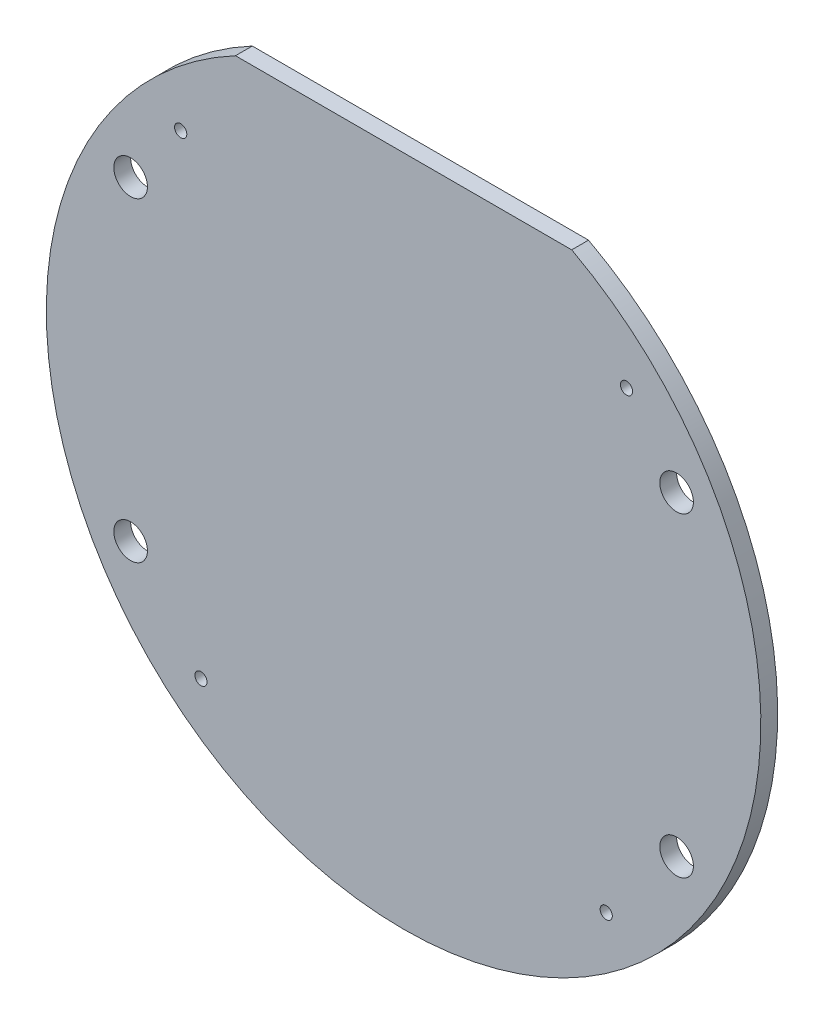
ISO-10303-21;
HEADER;
FILE_DESCRIPTION(('STEP AP214'),'2;1');
FILE_NAME('part.step','',(''),(''),'','','');
FILE_SCHEMA(('AUTOMOTIVE_DESIGN { 1 0 10303 214 1 1 1 1 }'));
ENDSEC;
DATA;
#1=APPLICATION_CONTEXT('core data for automotive mechanical design processes');
#2=APPLICATION_PROTOCOL_DEFINITION('international standard','automotive_design',2000,#1);
#3=PRODUCT_CONTEXT('',#1,'mechanical');
#4=PRODUCT('Part','Part','',(#3));
#5=PRODUCT_RELATED_PRODUCT_CATEGORY('part','',(#4));
#6=PRODUCT_DEFINITION_FORMATION('','',#4);
#7=PRODUCT_DEFINITION_CONTEXT('part definition',#1,'design');
#8=PRODUCT_DEFINITION('design','',#6,#7);
#9=PRODUCT_DEFINITION_SHAPE('','',#8);
#10=(LENGTH_UNIT() NAMED_UNIT(*) SI_UNIT(.MILLI.,.METRE.));
#11=(NAMED_UNIT(*) PLANE_ANGLE_UNIT() SI_UNIT($,.RADIAN.));
#12=(NAMED_UNIT(*) SI_UNIT($,.STERADIAN.) SOLID_ANGLE_UNIT());
#13=UNCERTAINTY_MEASURE_WITH_UNIT(LENGTH_MEASURE(1.E-05),#10,'distance_accuracy_value','');
#14=(GEOMETRIC_REPRESENTATION_CONTEXT(3) GLOBAL_UNCERTAINTY_ASSIGNED_CONTEXT((#13)) GLOBAL_UNIT_ASSIGNED_CONTEXT((#10,
#11,#12)) REPRESENTATION_CONTEXT('',''));
#15=CARTESIAN_POINT('',(0.,0.,0.));
#16=DIRECTION('',(0.,0.,1.));
#17=DIRECTION('',(1.,0.,0.));
#18=AXIS2_PLACEMENT_3D('',#15,#16,#17);
#19=CARTESIAN_POINT('',(0.,0.,4.));
#20=DIRECTION('',(0.,0.,-1.));
#21=DIRECTION('',(-1.,0.,0.));
#22=AXIS2_PLACEMENT_3D('',#19,#20,#21);
#23=CYLINDRICAL_SURFACE('',#22,85.);
#24=CARTESIAN_POINT('',(0.,0.,0.));
#25=DIRECTION('',(0.,0.,1.));
#26=DIRECTION('',(1.,0.,0.));
#27=AXIS2_PLACEMENT_3D('',#24,#25,#26);
#28=CIRCLE('',#27,85.);
#29=CARTESIAN_POINT('',(-40.,75.,0.));
#30=VERTEX_POINT('',#29);
#31=CARTESIAN_POINT('',(40.,75.,0.));
#32=VERTEX_POINT('',#31);
#33=EDGE_CURVE('E74',#30,#32,#28,.T.);
#34=ORIENTED_EDGE('',*,*,#33,.T.);
#35=DIRECTION('',(0.,0.,-1.));
#36=VECTOR('',#35,1.);
#37=CARTESIAN_POINT('',(40.,75.,4.));
#38=LINE('',#37,#36);
#39=CARTESIAN_POINT('',(40.,75.,4.));
#40=VERTEX_POINT('',#39);
#41=EDGE_CURVE('E11',#40,#32,#38,.T.);
#42=ORIENTED_EDGE('',*,*,#41,.F.);
#43=CARTESIAN_POINT('',(0.,0.,4.));
#44=DIRECTION('',(0.,0.,1.));
#45=DIRECTION('',(1.,0.,0.));
#46=AXIS2_PLACEMENT_3D('',#43,#44,#45);
#47=CIRCLE('',#46,85.);
#48=CARTESIAN_POINT('',(-40.,75.,4.));
#49=VERTEX_POINT('',#48);
#50=EDGE_CURVE('E73',#49,#40,#47,.T.);
#51=ORIENTED_EDGE('',*,*,#50,.F.);
#52=DIRECTION('',(0.,0.,-1.));
#53=VECTOR('',#52,1.);
#54=CARTESIAN_POINT('',(-40.,75.,4.));
#55=LINE('',#54,#53);
#56=EDGE_CURVE('E49',#49,#30,#55,.T.);
#57=ORIENTED_EDGE('',*,*,#56,.T.);
#58=EDGE_LOOP('',(#34,#42,#51,#57));
#59=FACE_BOUND('',#58,.T.);
#60=ADVANCED_FACE('F39',(#59),#23,.T.);
#61=CARTESIAN_POINT('',(-40.,75.,4.));
#62=DIRECTION('',(0.,-1.,0.));
#63=DIRECTION('',(1.,0.,0.));
#64=AXIS2_PLACEMENT_3D('',#61,#62,#63);
#65=PLANE('',#64);
#66=DIRECTION('',(-1.,0.,0.));
#67=VECTOR('',#66,1.);
#68=CARTESIAN_POINT('',(-40.,75.,0.));
#69=LINE('',#68,#67);
#70=EDGE_CURVE('E65',#32,#30,#69,.T.);
#71=ORIENTED_EDGE('',*,*,#70,.T.);
#72=ORIENTED_EDGE('',*,*,#56,.F.);
#73=DIRECTION('',(-1.,0.,0.));
#74=VECTOR('',#73,1.);
#75=CARTESIAN_POINT('',(-40.,75.,4.));
#76=LINE('',#75,#74);
#77=EDGE_CURVE('E57',#40,#49,#76,.T.);
#78=ORIENTED_EDGE('',*,*,#77,.F.);
#79=ORIENTED_EDGE('',*,*,#41,.T.);
#80=EDGE_LOOP('',(#71,#72,#78,#79));
#81=FACE_BOUND('',#80,.T.);
#82=ADVANCED_FACE('F68',(#81),#65,.F.);
#83=CARTESIAN_POINT('',(0.,0.,4.));
#84=DIRECTION('',(0.,0.,1.));
#85=DIRECTION('',(1.,0.,0.));
#86=AXIS2_PLACEMENT_3D('',#83,#84,#85);
#87=PLANE('',#86);
#88=CARTESIAN_POINT('',(-64.9519052838331,37.4999999999996,4.));
#89=DIRECTION('',(0.,0.,1.));
#90=DIRECTION('',(1.,0.,0.));
#91=AXIS2_PLACEMENT_3D('',#88,#89,#90);
#92=CIRCLE('',#91,4.);
#93=CARTESIAN_POINT('',(-60.9519052838331,37.4999999999996,4.));
#94=VERTEX_POINT('',#93);
#95=EDGE_CURVE('E233',#94,#94,#92,.T.);
#96=ORIENTED_EDGE('',*,*,#95,.F.);
#97=EDGE_LOOP('',(#96));
#98=FACE_BOUND('',#97,.T.);
#99=CARTESIAN_POINT('',(-64.9519052838331,-37.4999999999996,4.));
#100=DIRECTION('',(0.,0.,1.));
#101=DIRECTION('',(1.,0.,0.));
#102=AXIS2_PLACEMENT_3D('',#99,#100,#101);
#103=CIRCLE('',#102,4.);
#104=CARTESIAN_POINT('',(-60.9519052838331,-37.4999999999996,4.));
#105=VERTEX_POINT('',#104);
#106=EDGE_CURVE('E238',#105,#105,#103,.T.);
#107=ORIENTED_EDGE('',*,*,#106,.F.);
#108=EDGE_LOOP('',(#107));
#109=FACE_BOUND('',#108,.T.);
#110=CARTESIAN_POINT('',(64.9519052838328,37.5000000000001,4.));
#111=DIRECTION('',(0.,0.,1.));
#112=DIRECTION('',(1.,0.,0.));
#113=AXIS2_PLACEMENT_3D('',#110,#111,#112);
#114=CIRCLE('',#113,4.);
#115=CARTESIAN_POINT('',(68.9519052838329,37.5000000000001,4.));
#116=VERTEX_POINT('',#115);
#117=EDGE_CURVE('E250',#116,#116,#114,.T.);
#118=ORIENTED_EDGE('',*,*,#117,.F.);
#119=EDGE_LOOP('',(#118));
#120=FACE_BOUND('',#119,.T.);
#121=CARTESIAN_POINT('',(64.9519052838328,-37.5000000000001,4.));
#122=DIRECTION('',(0.,0.,1.));
#123=DIRECTION('',(1.,0.,0.));
#124=AXIS2_PLACEMENT_3D('',#121,#122,#123);
#125=CIRCLE('',#124,4.);
#126=CARTESIAN_POINT('',(68.9519052838329,-37.5000000000001,4.));
#127=VERTEX_POINT('',#126);
#128=EDGE_CURVE('E258',#127,#127,#125,.T.);
#129=ORIENTED_EDGE('',*,*,#128,.F.);
#130=EDGE_LOOP('',(#129));
#131=FACE_BOUND('',#130,.T.);
#132=CARTESIAN_POINT('',(-53.0330085889914,53.0330085889908,4.));
#133=DIRECTION('',(0.,0.,1.));
#134=DIRECTION('',(1.,0.,0.));
#135=AXIS2_PLACEMENT_3D('',#132,#133,#134);
#136=CIRCLE('',#135,1.45);
#137=CARTESIAN_POINT('',(-51.5830085889913,53.0330085889908,4.));
#138=VERTEX_POINT('',#137);
#139=EDGE_CURVE('E111',#138,#138,#136,.T.);
#140=ORIENTED_EDGE('',*,*,#139,.F.);
#141=EDGE_LOOP('',(#140));
#142=FACE_BOUND('',#141,.T.);
#143=CARTESIAN_POINT('',(53.033008588991,53.0330085889912,4.));
#144=DIRECTION('',(0.,0.,1.));
#145=DIRECTION('',(1.,0.,0.));
#146=AXIS2_PLACEMENT_3D('',#143,#144,#145);
#147=CIRCLE('',#146,1.45);
#148=CARTESIAN_POINT('',(54.483008588991,53.0330085889912,4.));
#149=VERTEX_POINT('',#148);
#150=EDGE_CURVE('E97',#149,#149,#147,.T.);
#151=ORIENTED_EDGE('',*,*,#150,.F.);
#152=EDGE_LOOP('',(#151));
#153=FACE_BOUND('',#152,.T.);
#154=CARTESIAN_POINT('',(48.2090707264903,-57.4533332339234,4.));
#155=DIRECTION('',(0.,0.,1.));
#156=DIRECTION('',(1.,0.,0.));
#157=AXIS2_PLACEMENT_3D('',#154,#155,#156);
#158=CIRCLE('',#157,1.45);
#159=CARTESIAN_POINT('',(49.6590707264903,-57.4533332339234,4.));
#160=VERTEX_POINT('',#159);
#161=EDGE_CURVE('E93',#160,#160,#158,.T.);
#162=ORIENTED_EDGE('',*,*,#161,.F.);
#163=EDGE_LOOP('',(#162));
#164=FACE_BOUND('',#163,.T.);
#165=CARTESIAN_POINT('',(-48.2090707264908,-57.4533332339231,4.));
#166=DIRECTION('',(0.,0.,1.));
#167=DIRECTION('',(1.,0.,0.));
#168=AXIS2_PLACEMENT_3D('',#165,#166,#167);
#169=CIRCLE('',#168,1.45);
#170=CARTESIAN_POINT('',(-46.7590707264907,-57.4533332339231,4.));
#171=VERTEX_POINT('',#170);
#172=EDGE_CURVE('E85',#171,#171,#169,.T.);
#173=ORIENTED_EDGE('',*,*,#172,.F.);
#174=EDGE_LOOP('',(#173));
#175=FACE_BOUND('',#174,.T.);
#176=ORIENTED_EDGE('',*,*,#50,.T.);
#177=ORIENTED_EDGE('',*,*,#77,.T.);
#178=EDGE_LOOP('',(#176,#177));
#179=FACE_BOUND('',#178,.T.);
#180=ADVANCED_FACE('F119',(#98,#109,#120,#131,#142,#153,#164,#175,#179),#87,.T.);
#181=CARTESIAN_POINT('',(0.,0.,0.));
#182=DIRECTION('',(0.,0.,1.));
#183=DIRECTION('',(1.,0.,0.));
#184=AXIS2_PLACEMENT_3D('',#181,#182,#183);
#185=PLANE('',#184);
#186=CARTESIAN_POINT('',(-64.9519052838331,37.4999999999996,0.));
#187=DIRECTION('',(0.,0.,1.));
#188=DIRECTION('',(1.,0.,0.));
#189=AXIS2_PLACEMENT_3D('',#186,#187,#188);
#190=CIRCLE('',#189,4.);
#191=CARTESIAN_POINT('',(-60.9519052838331,37.4999999999996,0.));
#192=VERTEX_POINT('',#191);
#193=EDGE_CURVE('E236',#192,#192,#190,.T.);
#194=ORIENTED_EDGE('',*,*,#193,.T.);
#195=EDGE_LOOP('',(#194));
#196=FACE_BOUND('',#195,.T.);
#197=CARTESIAN_POINT('',(-64.9519052838331,-37.4999999999996,0.));
#198=DIRECTION('',(0.,0.,1.));
#199=DIRECTION('',(1.,0.,0.));
#200=AXIS2_PLACEMENT_3D('',#197,#198,#199);
#201=CIRCLE('',#200,4.);
#202=CARTESIAN_POINT('',(-60.9519052838331,-37.4999999999996,0.));
#203=VERTEX_POINT('',#202);
#204=EDGE_CURVE('E243',#203,#203,#201,.T.);
#205=ORIENTED_EDGE('',*,*,#204,.T.);
#206=EDGE_LOOP('',(#205));
#207=FACE_BOUND('',#206,.T.);
#208=CARTESIAN_POINT('',(64.9519052838328,37.5000000000001,0.));
#209=DIRECTION('',(0.,0.,1.));
#210=DIRECTION('',(1.,0.,0.));
#211=AXIS2_PLACEMENT_3D('',#208,#209,#210);
#212=CIRCLE('',#211,4.);
#213=CARTESIAN_POINT('',(68.9519052838329,37.5000000000001,0.));
#214=VERTEX_POINT('',#213);
#215=EDGE_CURVE('E254',#214,#214,#212,.T.);
#216=ORIENTED_EDGE('',*,*,#215,.T.);
#217=EDGE_LOOP('',(#216));
#218=FACE_BOUND('',#217,.T.);
#219=CARTESIAN_POINT('',(64.9519052838328,-37.5000000000001,0.));
#220=DIRECTION('',(0.,0.,1.));
#221=DIRECTION('',(1.,0.,0.));
#222=AXIS2_PLACEMENT_3D('',#219,#220,#221);
#223=CIRCLE('',#222,4.);
#224=CARTESIAN_POINT('',(68.9519052838329,-37.5000000000001,0.));
#225=VERTEX_POINT('',#224);
#226=EDGE_CURVE('E42',#225,#225,#223,.T.);
#227=ORIENTED_EDGE('',*,*,#226,.T.);
#228=EDGE_LOOP('',(#227));
#229=FACE_BOUND('',#228,.T.);
#230=CARTESIAN_POINT('',(-53.0330085889914,53.0330085889908,0.));
#231=DIRECTION('',(0.,0.,1.));
#232=DIRECTION('',(1.,0.,0.));
#233=AXIS2_PLACEMENT_3D('',#230,#231,#232);
#234=CIRCLE('',#233,1.45);
#235=CARTESIAN_POINT('',(-51.5830085889913,53.0330085889908,0.));
#236=VERTEX_POINT('',#235);
#237=EDGE_CURVE('E105',#236,#236,#234,.T.);
#238=ORIENTED_EDGE('',*,*,#237,.T.);
#239=EDGE_LOOP('',(#238));
#240=FACE_BOUND('',#239,.T.);
#241=CARTESIAN_POINT('',(53.033008588991,53.0330085889912,0.));
#242=DIRECTION('',(0.,0.,1.));
#243=DIRECTION('',(1.,0.,0.));
#244=AXIS2_PLACEMENT_3D('',#241,#242,#243);
#245=CIRCLE('',#244,1.45);
#246=CARTESIAN_POINT('',(54.483008588991,53.0330085889912,0.));
#247=VERTEX_POINT('',#246);
#248=EDGE_CURVE('E94',#247,#247,#245,.T.);
#249=ORIENTED_EDGE('',*,*,#248,.T.);
#250=EDGE_LOOP('',(#249));
#251=FACE_BOUND('',#250,.T.);
#252=CARTESIAN_POINT('',(48.2090707264903,-57.4533332339234,0.));
#253=DIRECTION('',(0.,0.,1.));
#254=DIRECTION('',(1.,0.,0.));
#255=AXIS2_PLACEMENT_3D('',#252,#253,#254);
#256=CIRCLE('',#255,1.45);
#257=CARTESIAN_POINT('',(49.6590707264903,-57.4533332339234,0.));
#258=VERTEX_POINT('',#257);
#259=EDGE_CURVE('E90',#258,#258,#256,.T.);
#260=ORIENTED_EDGE('',*,*,#259,.T.);
#261=EDGE_LOOP('',(#260));
#262=FACE_BOUND('',#261,.T.);
#263=CARTESIAN_POINT('',(-48.2090707264908,-57.4533332339231,0.));
#264=DIRECTION('',(0.,0.,1.));
#265=DIRECTION('',(1.,0.,0.));
#266=AXIS2_PLACEMENT_3D('',#263,#264,#265);
#267=CIRCLE('',#266,1.45);
#268=CARTESIAN_POINT('',(-46.7590707264907,-57.4533332339231,0.));
#269=VERTEX_POINT('',#268);
#270=EDGE_CURVE('E81',#269,#269,#267,.T.);
#271=ORIENTED_EDGE('',*,*,#270,.T.);
#272=EDGE_LOOP('',(#271));
#273=FACE_BOUND('',#272,.T.);
#274=ORIENTED_EDGE('',*,*,#33,.F.);
#275=ORIENTED_EDGE('',*,*,#70,.F.);
#276=EDGE_LOOP('',(#274,#275));
#277=FACE_BOUND('',#276,.T.);
#278=ADVANCED_FACE('F79',(#196,#207,#218,#229,#240,#251,#262,#273,#277),#185,.F.);
#279=CARTESIAN_POINT('',(-48.2090707264908,-57.4533332339231,4.));
#280=DIRECTION('',(0.,0.,1.));
#281=DIRECTION('',(1.,0.,0.));
#282=AXIS2_PLACEMENT_3D('',#279,#280,#281);
#283=CYLINDRICAL_SURFACE('',#282,1.45);
#284=ORIENTED_EDGE('',*,*,#172,.T.);
#285=EDGE_LOOP('',(#284));
#286=FACE_BOUND('',#285,.T.);
#287=ORIENTED_EDGE('',*,*,#270,.F.);
#288=EDGE_LOOP('',(#287));
#289=FACE_BOUND('',#288,.T.);
#290=ADVANCED_FACE('F127',(#286,#289),#283,.F.);
#291=CARTESIAN_POINT('',(48.2090707264903,-57.4533332339234,4.));
#292=DIRECTION('',(0.,0.,1.));
#293=DIRECTION('',(1.,0.,0.));
#294=AXIS2_PLACEMENT_3D('',#291,#292,#293);
#295=CYLINDRICAL_SURFACE('',#294,1.45);
#296=ORIENTED_EDGE('',*,*,#161,.T.);
#297=EDGE_LOOP('',(#296));
#298=FACE_BOUND('',#297,.T.);
#299=ORIENTED_EDGE('',*,*,#259,.F.);
#300=EDGE_LOOP('',(#299));
#301=FACE_BOUND('',#300,.T.);
#302=ADVANCED_FACE('F150',(#298,#301),#295,.F.);
#303=CARTESIAN_POINT('',(53.033008588991,53.0330085889912,4.));
#304=DIRECTION('',(0.,0.,1.));
#305=DIRECTION('',(1.,0.,0.));
#306=AXIS2_PLACEMENT_3D('',#303,#304,#305);
#307=CYLINDRICAL_SURFACE('',#306,1.45);
#308=ORIENTED_EDGE('',*,*,#150,.T.);
#309=EDGE_LOOP('',(#308));
#310=FACE_BOUND('',#309,.T.);
#311=ORIENTED_EDGE('',*,*,#248,.F.);
#312=EDGE_LOOP('',(#311));
#313=FACE_BOUND('',#312,.T.);
#314=ADVANCED_FACE('F160',(#310,#313),#307,.F.);
#315=CARTESIAN_POINT('',(-53.0330085889914,53.0330085889908,4.));
#316=DIRECTION('',(0.,0.,1.));
#317=DIRECTION('',(1.,0.,0.));
#318=AXIS2_PLACEMENT_3D('',#315,#316,#317);
#319=CYLINDRICAL_SURFACE('',#318,1.45);
#320=ORIENTED_EDGE('',*,*,#139,.T.);
#321=EDGE_LOOP('',(#320));
#322=FACE_BOUND('',#321,.T.);
#323=ORIENTED_EDGE('',*,*,#237,.F.);
#324=EDGE_LOOP('',(#323));
#325=FACE_BOUND('',#324,.T.);
#326=ADVANCED_FACE('F170',(#322,#325),#319,.F.);
#327=CARTESIAN_POINT('',(64.9519052838328,-37.5000000000001,4.));
#328=DIRECTION('',(0.,0.,1.));
#329=DIRECTION('',(1.,0.,0.));
#330=AXIS2_PLACEMENT_3D('',#327,#328,#329);
#331=CYLINDRICAL_SURFACE('',#330,4.);
#332=ORIENTED_EDGE('',*,*,#128,.T.);
#333=EDGE_LOOP('',(#332));
#334=FACE_BOUND('',#333,.T.);
#335=ORIENTED_EDGE('',*,*,#226,.F.);
#336=EDGE_LOOP('',(#335));
#337=FACE_BOUND('',#336,.T.);
#338=ADVANCED_FACE('F178',(#334,#337),#331,.F.);
#339=CARTESIAN_POINT('',(64.9519052838328,37.5000000000001,4.));
#340=DIRECTION('',(0.,0.,1.));
#341=DIRECTION('',(1.,0.,0.));
#342=AXIS2_PLACEMENT_3D('',#339,#340,#341);
#343=CYLINDRICAL_SURFACE('',#342,4.);
#344=ORIENTED_EDGE('',*,*,#117,.T.);
#345=EDGE_LOOP('',(#344));
#346=FACE_BOUND('',#345,.T.);
#347=ORIENTED_EDGE('',*,*,#215,.F.);
#348=EDGE_LOOP('',(#347));
#349=FACE_BOUND('',#348,.T.);
#350=ADVANCED_FACE('F197',(#346,#349),#343,.F.);
#351=CARTESIAN_POINT('',(-64.9519052838331,-37.4999999999996,4.));
#352=DIRECTION('',(0.,0.,1.));
#353=DIRECTION('',(1.,0.,0.));
#354=AXIS2_PLACEMENT_3D('',#351,#352,#353);
#355=CYLINDRICAL_SURFACE('',#354,4.);
#356=ORIENTED_EDGE('',*,*,#106,.T.);
#357=EDGE_LOOP('',(#356));
#358=FACE_BOUND('',#357,.T.);
#359=ORIENTED_EDGE('',*,*,#204,.F.);
#360=EDGE_LOOP('',(#359));
#361=FACE_BOUND('',#360,.T.);
#362=ADVANCED_FACE('F207',(#358,#361),#355,.F.);
#363=CARTESIAN_POINT('',(-64.9519052838331,37.4999999999996,4.));
#364=DIRECTION('',(0.,0.,1.));
#365=DIRECTION('',(1.,0.,0.));
#366=AXIS2_PLACEMENT_3D('',#363,#364,#365);
#367=CYLINDRICAL_SURFACE('',#366,4.);
#368=ORIENTED_EDGE('',*,*,#95,.T.);
#369=EDGE_LOOP('',(#368));
#370=FACE_BOUND('',#369,.T.);
#371=ORIENTED_EDGE('',*,*,#193,.F.);
#372=EDGE_LOOP('',(#371));
#373=FACE_BOUND('',#372,.T.);
#374=ADVANCED_FACE('F217',(#370,#373),#367,.F.);
#375=CLOSED_SHELL('',(#60,#82,#180,#278,#290,#302,#314,#326,#338,#350,#362,#374));
#376=MANIFOLD_SOLID_BREP('B2',#375);
#377=ADVANCED_BREP_SHAPE_REPRESENTATION('',(#18,#376),#14);
#378=SHAPE_DEFINITION_REPRESENTATION(#9,#377);
ENDSEC;
END-ISO-10303-21;
